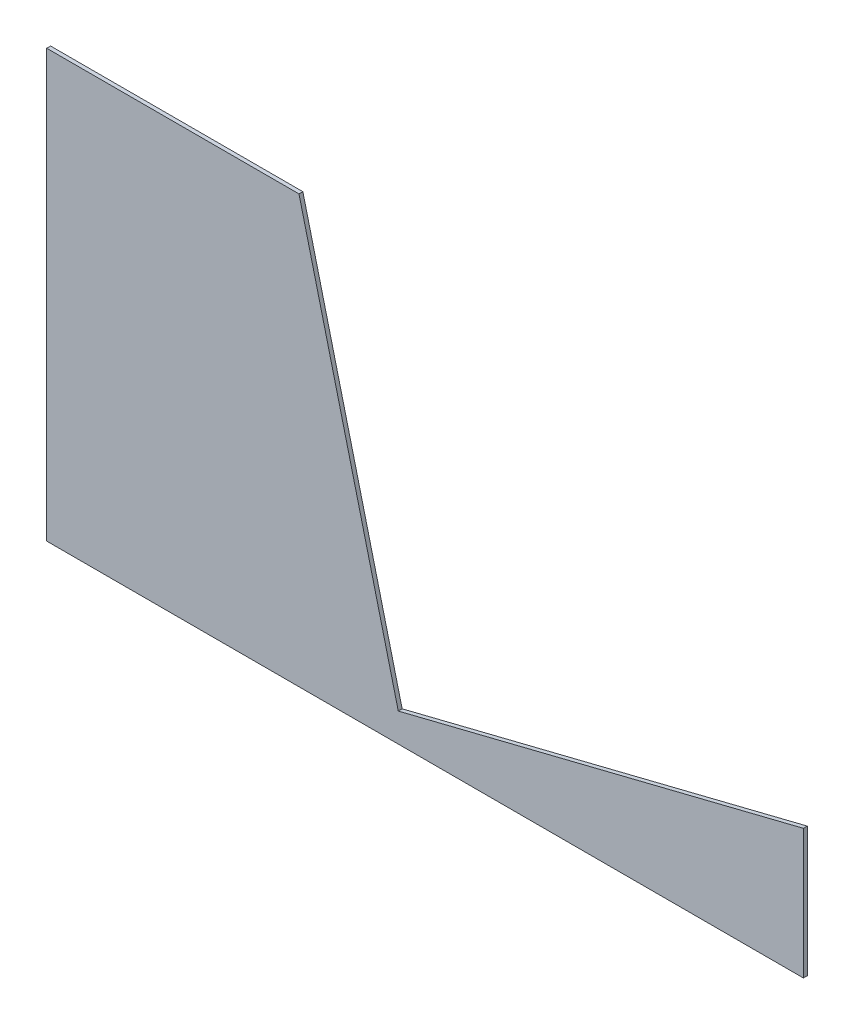
ISO-10303-21;
HEADER;
FILE_DESCRIPTION(('STEP AP214'),'2;1');
FILE_NAME('part.step','',(''),(''),'','','');
FILE_SCHEMA(('AUTOMOTIVE_DESIGN { 1 0 10303 214 1 1 1 1 }'));
ENDSEC;
DATA;
#1=APPLICATION_CONTEXT('core data for automotive mechanical design processes');
#2=APPLICATION_PROTOCOL_DEFINITION('international standard','automotive_design',2000,#1);
#3=PRODUCT_CONTEXT('',#1,'mechanical');
#4=PRODUCT('Part','Part','',(#3));
#5=PRODUCT_RELATED_PRODUCT_CATEGORY('part','',(#4));
#6=PRODUCT_DEFINITION_FORMATION('','',#4);
#7=PRODUCT_DEFINITION_CONTEXT('part definition',#1,'design');
#8=PRODUCT_DEFINITION('design','',#6,#7);
#9=PRODUCT_DEFINITION_SHAPE('','',#8);
#10=(LENGTH_UNIT() NAMED_UNIT(*) SI_UNIT(.MILLI.,.METRE.));
#11=(NAMED_UNIT(*) PLANE_ANGLE_UNIT() SI_UNIT($,.RADIAN.));
#12=(NAMED_UNIT(*) SI_UNIT($,.STERADIAN.) SOLID_ANGLE_UNIT());
#13=UNCERTAINTY_MEASURE_WITH_UNIT(LENGTH_MEASURE(1.E-05),#10,'distance_accuracy_value','');
#14=(GEOMETRIC_REPRESENTATION_CONTEXT(3) GLOBAL_UNCERTAINTY_ASSIGNED_CONTEXT((#13)) GLOBAL_UNIT_ASSIGNED_CONTEXT((#10,
#11,#12)) REPRESENTATION_CONTEXT('',''));
#15=CARTESIAN_POINT('',(0.,0.,0.));
#16=DIRECTION('',(0.,0.,1.));
#17=DIRECTION('',(1.,0.,0.));
#18=AXIS2_PLACEMENT_3D('',#15,#16,#17);
#19=CARTESIAN_POINT('',(345.000000000001,-1.71977124899629E-12,1.));
#20=DIRECTION('',(1.,0.,0.));
#21=DIRECTION('',(0.,1.,0.));
#22=AXIS2_PLACEMENT_3D('',#19,#20,#21);
#23=PLANE('',#22);
#24=DIRECTION('',(0.,-1.,0.));
#25=VECTOR('',#24,1.);
#26=CARTESIAN_POINT('',(345.000000000001,-1.71977124899629E-12,0.));
#27=LINE('',#26,#25);
#28=CARTESIAN_POINT('',(344.999999999999,-416.592044402484,0.));
#29=VERTEX_POINT('',#28);
#30=CARTESIAN_POINT('',(344.999999999999,-450.,0.));
#31=VERTEX_POINT('',#30);
#32=EDGE_CURVE('E125',#29,#31,#27,.T.);
#33=ORIENTED_EDGE('',*,*,#32,.F.);
#34=DIRECTION('',(0.,0.,-1.));
#35=VECTOR('',#34,1.);
#36=CARTESIAN_POINT('',(344.999999999999,-416.592044402484,1.));
#37=LINE('',#36,#35);
#38=CARTESIAN_POINT('',(344.999999999999,-416.592044402484,1.));
#39=VERTEX_POINT('',#38);
#40=EDGE_CURVE('E11',#39,#29,#37,.T.);
#41=ORIENTED_EDGE('',*,*,#40,.F.);
#42=DIRECTION('',(0.,-1.,0.));
#43=VECTOR('',#42,1.);
#44=CARTESIAN_POINT('',(345.000000000001,-1.71977124899629E-12,1.));
#45=LINE('',#44,#43);
#46=CARTESIAN_POINT('',(344.999999999999,-450.,1.));
#47=VERTEX_POINT('',#46);
#48=EDGE_CURVE('E139',#39,#47,#45,.T.);
#49=ORIENTED_EDGE('',*,*,#48,.T.);
#50=DIRECTION('',(0.,0.,-1.));
#51=VECTOR('',#50,1.);
#52=CARTESIAN_POINT('',(344.999999999999,-450.,1.));
#53=LINE('',#52,#51);
#54=EDGE_CURVE('E58',#47,#31,#53,.T.);
#55=ORIENTED_EDGE('',*,*,#54,.T.);
#56=EDGE_LOOP('',(#33,#41,#49,#55));
#57=FACE_BOUND('',#56,.T.);
#58=ADVANCED_FACE('F42',(#57),#23,.T.);
#59=CARTESIAN_POINT('',(117.980599296732,-473.194338186484,1.));
#60=DIRECTION('',(-0.241921895599659,0.970295726275999,0.));
#61=DIRECTION('',(-0.970295726275999,-0.241921895599659,0.));
#62=AXIS2_PLACEMENT_3D('',#59,#60,#61);
#63=PLANE('',#62);
#64=DIRECTION('',(0.970295726275999,0.241921895599659,0.));
#65=VECTOR('',#64,1.);
#66=CARTESIAN_POINT('',(117.980599296732,-473.194338186484,0.));
#67=LINE('',#66,#65);
#68=CARTESIAN_POINT('',(240.595404029929,-442.62303380335,0.));
#69=VERTEX_POINT('',#68);
#70=EDGE_CURVE('E127',#69,#29,#67,.T.);
#71=ORIENTED_EDGE('',*,*,#70,.F.);
#72=DIRECTION('',(0.,0.,-1.));
#73=VECTOR('',#72,1.);
#74=CARTESIAN_POINT('',(240.595404029929,-442.62303380335,1.));
#75=LINE('',#74,#73);
#76=CARTESIAN_POINT('',(240.595404029929,-442.62303380335,1.));
#77=VERTEX_POINT('',#76);
#78=EDGE_CURVE('E50',#77,#69,#75,.T.);
#79=ORIENTED_EDGE('',*,*,#78,.F.);
#80=DIRECTION('',(0.970295726275999,0.241921895599659,0.));
#81=VECTOR('',#80,1.);
#82=CARTESIAN_POINT('',(117.980599296732,-473.194338186484,1.));
#83=LINE('',#82,#81);
#84=EDGE_CURVE('E120',#77,#39,#83,.T.);
#85=ORIENTED_EDGE('',*,*,#84,.T.);
#86=ORIENTED_EDGE('',*,*,#40,.T.);
#87=EDGE_LOOP('',(#71,#79,#85,#86));
#88=FACE_BOUND('',#87,.T.);
#89=ADVANCED_FACE('F148',(#88),#63,.T.);
#90=CARTESIAN_POINT('',(122.614804733197,30.5713043831334,1.));
#91=DIRECTION('',(0.970295726275999,0.241921895599659,0.));
#92=DIRECTION('',(-0.241921895599659,0.970295726275999,0.));
#93=AXIS2_PLACEMENT_3D('',#90,#91,#92);
#94=PLANE('',#93);
#95=DIRECTION('',(0.241921895599659,-0.970295726275999,0.));
#96=VECTOR('',#95,1.);
#97=CARTESIAN_POINT('',(122.614804733197,30.5713043831334,0.));
#98=LINE('',#97,#96);
#99=CARTESIAN_POINT('',(215.008607966032,-340.,0.));
#100=VERTEX_POINT('',#99);
#101=EDGE_CURVE('E130',#100,#69,#98,.T.);
#102=ORIENTED_EDGE('',*,*,#101,.F.);
#103=DIRECTION('',(0.,0.,-1.));
#104=VECTOR('',#103,1.);
#105=CARTESIAN_POINT('',(215.008607966032,-340.,1.));
#106=LINE('',#105,#104);
#107=CARTESIAN_POINT('',(215.008607966032,-340.,1.));
#108=VERTEX_POINT('',#107);
#109=EDGE_CURVE('E106',#108,#100,#106,.T.);
#110=ORIENTED_EDGE('',*,*,#109,.F.);
#111=DIRECTION('',(0.241921895599659,-0.970295726275999,0.));
#112=VECTOR('',#111,1.);
#113=CARTESIAN_POINT('',(122.614804733197,30.5713043831334,1.));
#114=LINE('',#113,#112);
#115=EDGE_CURVE('E118',#108,#77,#114,.T.);
#116=ORIENTED_EDGE('',*,*,#115,.T.);
#117=ORIENTED_EDGE('',*,*,#78,.T.);
#118=EDGE_LOOP('',(#102,#110,#116,#117));
#119=FACE_BOUND('',#118,.T.);
#120=ADVANCED_FACE('F145',(#119),#94,.T.);
#121=CARTESIAN_POINT('',(0.,-340.,1.));
#122=DIRECTION('',(0.,1.,0.));
#123=DIRECTION('',(0.,0.,1.));
#124=AXIS2_PLACEMENT_3D('',#121,#122,#123);
#125=PLANE('',#124);
#126=DIRECTION('',(1.,0.,0.));
#127=VECTOR('',#126,1.);
#128=CARTESIAN_POINT('',(0.,-340.,0.));
#129=LINE('',#128,#127);
#130=CARTESIAN_POINT('',(150.,-340.,0.));
#131=VERTEX_POINT('',#130);
#132=EDGE_CURVE('E103',#131,#100,#129,.T.);
#133=ORIENTED_EDGE('',*,*,#132,.F.);
#134=DIRECTION('',(0.,0.,-1.));
#135=VECTOR('',#134,1.);
#136=CARTESIAN_POINT('',(150.,-340.,1.));
#137=LINE('',#136,#135);
#138=CARTESIAN_POINT('',(150.,-340.,1.));
#139=VERTEX_POINT('',#138);
#140=EDGE_CURVE('E97',#139,#131,#137,.T.);
#141=ORIENTED_EDGE('',*,*,#140,.F.);
#142=DIRECTION('',(1.,0.,0.));
#143=VECTOR('',#142,1.);
#144=CARTESIAN_POINT('',(0.,-340.,1.));
#145=LINE('',#144,#143);
#146=EDGE_CURVE('E101',#139,#108,#145,.T.);
#147=ORIENTED_EDGE('',*,*,#146,.T.);
#148=ORIENTED_EDGE('',*,*,#109,.T.);
#149=EDGE_LOOP('',(#133,#141,#147,#148));
#150=FACE_BOUND('',#149,.T.);
#151=ADVANCED_FACE('F99',(#150),#125,.T.);
#152=CARTESIAN_POINT('',(150.,0.,1.));
#153=DIRECTION('',(1.,0.,0.));
#154=DIRECTION('',(0.,0.,-1.));
#155=AXIS2_PLACEMENT_3D('',#152,#153,#154);
#156=PLANE('',#155);
#157=DIRECTION('',(0.,-1.,0.));
#158=VECTOR('',#157,1.);
#159=CARTESIAN_POINT('',(150.,0.,0.));
#160=LINE('',#159,#158);
#161=CARTESIAN_POINT('',(150.,-450.,0.));
#162=VERTEX_POINT('',#161);
#163=EDGE_CURVE('E134',#131,#162,#160,.T.);
#164=ORIENTED_EDGE('',*,*,#163,.T.);
#165=DIRECTION('',(0.,0.,-1.));
#166=VECTOR('',#165,1.);
#167=CARTESIAN_POINT('',(150.,-450.,1.));
#168=LINE('',#167,#166);
#169=CARTESIAN_POINT('',(150.,-450.,1.));
#170=VERTEX_POINT('',#169);
#171=EDGE_CURVE('E78',#170,#162,#168,.T.);
#172=ORIENTED_EDGE('',*,*,#171,.F.);
#173=DIRECTION('',(0.,-1.,0.));
#174=VECTOR('',#173,1.);
#175=CARTESIAN_POINT('',(150.,0.,1.));
#176=LINE('',#175,#174);
#177=EDGE_CURVE('E108',#139,#170,#176,.T.);
#178=ORIENTED_EDGE('',*,*,#177,.F.);
#179=ORIENTED_EDGE('',*,*,#140,.T.);
#180=EDGE_LOOP('',(#164,#172,#178,#179));
#181=FACE_BOUND('',#180,.T.);
#182=ADVANCED_FACE('F109',(#181),#156,.F.);
#183=CARTESIAN_POINT('',(0.,-450.,1.));
#184=DIRECTION('',(0.,-1.,0.));
#185=DIRECTION('',(0.,0.,-1.));
#186=AXIS2_PLACEMENT_3D('',#183,#184,#185);
#187=PLANE('',#186);
#188=DIRECTION('',(-1.,0.,0.));
#189=VECTOR('',#188,1.);
#190=CARTESIAN_POINT('',(0.,-450.,0.));
#191=LINE('',#190,#189);
#192=EDGE_CURVE('E136',#31,#162,#191,.T.);
#193=ORIENTED_EDGE('',*,*,#192,.F.);
#194=ORIENTED_EDGE('',*,*,#54,.F.);
#195=DIRECTION('',(-1.,0.,0.));
#196=VECTOR('',#195,1.);
#197=CARTESIAN_POINT('',(0.,-450.,1.));
#198=LINE('',#197,#196);
#199=EDGE_CURVE('E112',#47,#170,#198,.T.);
#200=ORIENTED_EDGE('',*,*,#199,.T.);
#201=ORIENTED_EDGE('',*,*,#171,.T.);
#202=EDGE_LOOP('',(#193,#194,#200,#201));
#203=FACE_BOUND('',#202,.T.);
#204=ADVANCED_FACE('F151',(#203),#187,.T.);
#205=CARTESIAN_POINT('',(0.,0.,1.));
#206=DIRECTION('',(0.,0.,1.));
#207=DIRECTION('',(1.,0.,0.));
#208=AXIS2_PLACEMENT_3D('',#205,#206,#207);
#209=PLANE('',#208);
#210=ORIENTED_EDGE('',*,*,#48,.F.);
#211=ORIENTED_EDGE('',*,*,#84,.F.);
#212=ORIENTED_EDGE('',*,*,#115,.F.);
#213=ORIENTED_EDGE('',*,*,#146,.F.);
#214=ORIENTED_EDGE('',*,*,#177,.T.);
#215=ORIENTED_EDGE('',*,*,#199,.F.);
#216=EDGE_LOOP('',(#210,#211,#212,#213,#214,#215));
#217=FACE_BOUND('',#216,.T.);
#218=ADVANCED_FACE('F115',(#217),#209,.T.);
#219=CARTESIAN_POINT('',(0.,0.,0.));
#220=DIRECTION('',(0.,0.,1.));
#221=DIRECTION('',(1.,0.,0.));
#222=AXIS2_PLACEMENT_3D('',#219,#220,#221);
#223=PLANE('',#222);
#224=ORIENTED_EDGE('',*,*,#32,.T.);
#225=ORIENTED_EDGE('',*,*,#192,.T.);
#226=ORIENTED_EDGE('',*,*,#163,.F.);
#227=ORIENTED_EDGE('',*,*,#132,.T.);
#228=ORIENTED_EDGE('',*,*,#101,.T.);
#229=ORIENTED_EDGE('',*,*,#70,.T.);
#230=EDGE_LOOP('',(#224,#225,#226,#227,#228,#229));
#231=FACE_BOUND('',#230,.T.);
#232=ADVANCED_FACE('F150',(#231),#223,.F.);
#233=CLOSED_SHELL('',(#58,#89,#120,#151,#182,#204,#218,#232));
#234=MANIFOLD_SOLID_BREP('B2',#233);
#235=ADVANCED_BREP_SHAPE_REPRESENTATION('',(#18,#234),#14);
#236=SHAPE_DEFINITION_REPRESENTATION(#9,#235);
ENDSEC;
END-ISO-10303-21;
